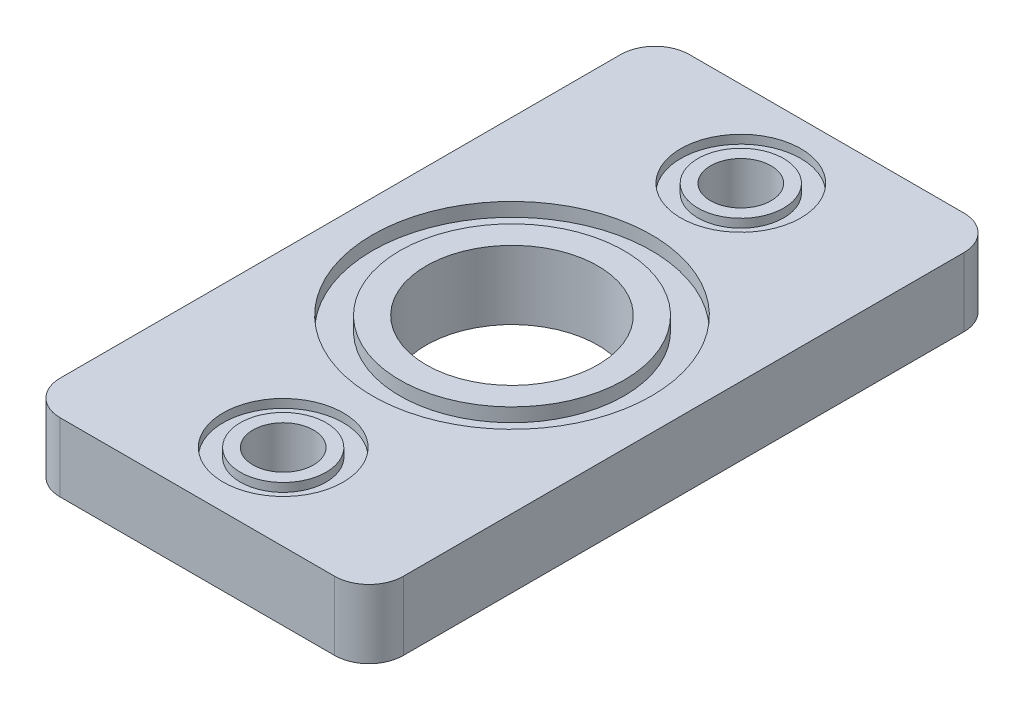
ISO-10303-21;
HEADER;
FILE_DESCRIPTION(('STEP AP214'),'2;1');
FILE_NAME('part.step','',(''),(''),'','','');
FILE_SCHEMA(('AUTOMOTIVE_DESIGN { 1 0 10303 214 1 1 1 1 }'));
ENDSEC;
DATA;
#1=APPLICATION_CONTEXT('core data for automotive mechanical design processes');
#2=APPLICATION_PROTOCOL_DEFINITION('international standard','automotive_design',2000,#1);
#3=PRODUCT_CONTEXT('',#1,'mechanical');
#4=PRODUCT('Part','Part','',(#3));
#5=PRODUCT_RELATED_PRODUCT_CATEGORY('part','',(#4));
#6=PRODUCT_DEFINITION_FORMATION('','',#4);
#7=PRODUCT_DEFINITION_CONTEXT('part definition',#1,'design');
#8=PRODUCT_DEFINITION('design','',#6,#7);
#9=PRODUCT_DEFINITION_SHAPE('','',#8);
#10=(LENGTH_UNIT() NAMED_UNIT(*) SI_UNIT(.MILLI.,.METRE.));
#11=(NAMED_UNIT(*) PLANE_ANGLE_UNIT() SI_UNIT($,.RADIAN.));
#12=(NAMED_UNIT(*) SI_UNIT($,.STERADIAN.) SOLID_ANGLE_UNIT());
#13=UNCERTAINTY_MEASURE_WITH_UNIT(LENGTH_MEASURE(1.E-05),#10,'distance_accuracy_value','');
#14=(GEOMETRIC_REPRESENTATION_CONTEXT(3) GLOBAL_UNCERTAINTY_ASSIGNED_CONTEXT((#13)) GLOBAL_UNIT_ASSIGNED_CONTEXT((#10,
#11,#12)) REPRESENTATION_CONTEXT('',''));
#15=CARTESIAN_POINT('',(0.,0.,0.));
#16=DIRECTION('',(0.,0.,1.));
#17=DIRECTION('',(1.,0.,0.));
#18=AXIS2_PLACEMENT_3D('',#15,#16,#17);
#19=CARTESIAN_POINT('',(0.,6.,0.));
#20=DIRECTION('',(0.,-1.,0.));
#21=DIRECTION('',(0.,0.,-1.));
#22=AXIS2_PLACEMENT_3D('',#19,#20,#21);
#23=PLANE('',#22);
#24=CARTESIAN_POINT('',(0.,6.,20.));
#25=DIRECTION('',(0.,1.,0.));
#26=DIRECTION('',(0.,0.,-1.));
#27=AXIS2_PLACEMENT_3D('',#24,#25,#26);
#28=CIRCLE('',#27,2.65);
#29=CARTESIAN_POINT('',(0.,6.,22.65));
#30=VERTEX_POINT('',#29);
#31=EDGE_CURVE('E199',#30,#30,#28,.T.);
#32=ORIENTED_EDGE('',*,*,#31,.F.);
#33=EDGE_LOOP('',(#32));
#34=FACE_BOUND('',#33,.T.);
#35=CARTESIAN_POINT('',(0.,6.,20.));
#36=DIRECTION('',(0.,1.,0.));
#37=DIRECTION('',(1.,0.,0.));
#38=AXIS2_PLACEMENT_3D('',#35,#36,#37);
#39=CIRCLE('',#38,3.75);
#40=CARTESIAN_POINT('',(3.75,6.,20.));
#41=VERTEX_POINT('',#40);
#42=EDGE_CURVE('E232',#41,#41,#39,.T.);
#43=ORIENTED_EDGE('',*,*,#42,.T.);
#44=EDGE_LOOP('',(#43));
#45=FACE_BOUND('',#44,.T.);
#46=ADVANCED_FACE('F57',(#34,#45),#23,.F.);
#47=CARTESIAN_POINT('',(0.,6.,-20.));
#48=DIRECTION('',(0.,1.,0.));
#49=DIRECTION('',(0.,0.,1.));
#50=AXIS2_PLACEMENT_3D('',#47,#48,#49);
#51=CIRCLE('',#50,2.65);
#52=CARTESIAN_POINT('',(0.,6.,-17.35));
#53=VERTEX_POINT('',#52);
#54=EDGE_CURVE('E204',#53,#53,#51,.T.);
#55=ORIENTED_EDGE('',*,*,#54,.F.);
#56=EDGE_LOOP('',(#55));
#57=FACE_BOUND('',#56,.T.);
#58=CARTESIAN_POINT('',(0.,6.,-20.));
#59=DIRECTION('',(0.,1.,0.));
#60=DIRECTION('',(1.,0.,0.));
#61=AXIS2_PLACEMENT_3D('',#58,#59,#60);
#62=CIRCLE('',#61,3.75);
#63=CARTESIAN_POINT('',(3.75,6.,-20.));
#64=VERTEX_POINT('',#63);
#65=EDGE_CURVE('E233',#64,#64,#62,.T.);
#66=ORIENTED_EDGE('',*,*,#65,.T.);
#67=EDGE_LOOP('',(#66));
#68=FACE_BOUND('',#67,.T.);
#69=ADVANCED_FACE('F292',(#57,#68),#23,.F.);
#70=CARTESIAN_POINT('',(0.,6.,0.));
#71=DIRECTION('',(0.,1.,0.));
#72=DIRECTION('',(0.,0.,1.));
#73=AXIS2_PLACEMENT_3D('',#70,#71,#72);
#74=CIRCLE('',#73,7.50000000000001);
#75=CARTESIAN_POINT('',(0.,6.,7.50000000000001));
#76=VERTEX_POINT('',#75);
#77=EDGE_CURVE('E187',#76,#76,#74,.T.);
#78=ORIENTED_EDGE('',*,*,#77,.F.);
#79=EDGE_LOOP('',(#78));
#80=FACE_BOUND('',#79,.T.);
#81=CARTESIAN_POINT('',(0.,6.,0.));
#82=DIRECTION('',(0.,1.,0.));
#83=DIRECTION('',(1.,0.,0.));
#84=AXIS2_PLACEMENT_3D('',#81,#82,#83);
#85=CIRCLE('',#84,9.8);
#86=CARTESIAN_POINT('',(9.8,6.,0.));
#87=VERTEX_POINT('',#86);
#88=EDGE_CURVE('E219',#87,#87,#85,.T.);
#89=ORIENTED_EDGE('',*,*,#88,.T.);
#90=EDGE_LOOP('',(#89));
#91=FACE_BOUND('',#90,.T.);
#92=ADVANCED_FACE('F269',(#80,#91),#23,.F.);
#93=CARTESIAN_POINT('',(-15.,6.,-27.5));
#94=DIRECTION('',(1.,0.,0.));
#95=DIRECTION('',(0.,0.,-1.));
#96=AXIS2_PLACEMENT_3D('',#93,#94,#95);
#97=PLANE('',#96);
#98=DIRECTION('',(0.,0.,1.));
#99=VECTOR('',#98,1.);
#100=CARTESIAN_POINT('',(-15.,6.,-27.5));
#101=LINE('',#100,#99);
#102=CARTESIAN_POINT('',(-15.,6.,-24.5));
#103=VERTEX_POINT('',#102);
#104=CARTESIAN_POINT('',(-15.,6.,24.5));
#105=VERTEX_POINT('',#104);
#106=EDGE_CURVE('E149',#103,#105,#101,.T.);
#107=ORIENTED_EDGE('',*,*,#106,.F.);
#108=DIRECTION('',(0.,-1.,0.));
#109=VECTOR('',#108,1.);
#110=CARTESIAN_POINT('',(-15.,6.,-24.5));
#111=LINE('',#110,#109);
#112=CARTESIAN_POINT('',(-15.,0.,-24.5));
#113=VERTEX_POINT('',#112);
#114=EDGE_CURVE('E175',#103,#113,#111,.T.);
#115=ORIENTED_EDGE('',*,*,#114,.T.);
#116=DIRECTION('',(0.,0.,1.));
#117=VECTOR('',#116,1.);
#118=CARTESIAN_POINT('',(-15.,0.,-27.5));
#119=LINE('',#118,#117);
#120=CARTESIAN_POINT('',(-15.,0.,24.5));
#121=VERTEX_POINT('',#120);
#122=EDGE_CURVE('E182',#113,#121,#119,.T.);
#123=ORIENTED_EDGE('',*,*,#122,.T.);
#124=DIRECTION('',(0.,-1.,0.));
#125=VECTOR('',#124,1.);
#126=CARTESIAN_POINT('',(-15.,6.,24.5));
#127=LINE('',#126,#125);
#128=EDGE_CURVE('E173',#121,#105,#127,.F.);
#129=ORIENTED_EDGE('',*,*,#128,.T.);
#130=EDGE_LOOP('',(#107,#115,#123,#129));
#131=FACE_BOUND('',#130,.T.);
#132=ADVANCED_FACE('F181',(#131),#97,.F.);
#133=CARTESIAN_POINT('',(15.,6.,27.5));
#134=DIRECTION('',(0.,0.,-1.));
#135=DIRECTION('',(-1.,0.,0.));
#136=AXIS2_PLACEMENT_3D('',#133,#134,#135);
#137=PLANE('',#136);
#138=DIRECTION('',(1.,0.,0.));
#139=VECTOR('',#138,1.);
#140=CARTESIAN_POINT('',(15.,6.,27.5));
#141=LINE('',#140,#139);
#142=CARTESIAN_POINT('',(-12.,6.,27.5));
#143=VERTEX_POINT('',#142);
#144=CARTESIAN_POINT('',(12.,6.,27.5));
#145=VERTEX_POINT('',#144);
#146=EDGE_CURVE('E152',#143,#145,#141,.T.);
#147=ORIENTED_EDGE('',*,*,#146,.F.);
#148=DIRECTION('',(0.,-1.,0.));
#149=VECTOR('',#148,1.);
#150=CARTESIAN_POINT('',(-12.,6.,27.5));
#151=LINE('',#150,#149);
#152=CARTESIAN_POINT('',(-12.,0.,27.5));
#153=VERTEX_POINT('',#152);
#154=EDGE_CURVE('E12',#143,#153,#151,.T.);
#155=ORIENTED_EDGE('',*,*,#154,.T.);
#156=DIRECTION('',(1.,0.,0.));
#157=VECTOR('',#156,1.);
#158=CARTESIAN_POINT('',(15.,0.,27.5));
#159=LINE('',#158,#157);
#160=CARTESIAN_POINT('',(12.,0.,27.5));
#161=VERTEX_POINT('',#160);
#162=EDGE_CURVE('E154',#153,#161,#159,.T.);
#163=ORIENTED_EDGE('',*,*,#162,.T.);
#164=DIRECTION('',(0.,-1.,0.));
#165=VECTOR('',#164,1.);
#166=CARTESIAN_POINT('',(12.,6.,27.5));
#167=LINE('',#166,#165);
#168=EDGE_CURVE('E65',#161,#145,#167,.F.);
#169=ORIENTED_EDGE('',*,*,#168,.T.);
#170=EDGE_LOOP('',(#147,#155,#163,#169));
#171=FACE_BOUND('',#170,.T.);
#172=ADVANCED_FACE('F279',(#171),#137,.F.);
#173=CARTESIAN_POINT('',(15.,6.,-27.5));
#174=DIRECTION('',(-1.,0.,0.));
#175=DIRECTION('',(0.,0.,1.));
#176=AXIS2_PLACEMENT_3D('',#173,#174,#175);
#177=PLANE('',#176);
#178=DIRECTION('',(0.,0.,-1.));
#179=VECTOR('',#178,1.);
#180=CARTESIAN_POINT('',(15.,0.,-27.5));
#181=LINE('',#180,#179);
#182=CARTESIAN_POINT('',(15.,0.,24.5));
#183=VERTEX_POINT('',#182);
#184=CARTESIAN_POINT('',(15.,0.,-24.5));
#185=VERTEX_POINT('',#184);
#186=EDGE_CURVE('E150',#183,#185,#181,.T.);
#187=ORIENTED_EDGE('',*,*,#186,.T.);
#188=DIRECTION('',(0.,-1.,0.));
#189=VECTOR('',#188,1.);
#190=CARTESIAN_POINT('',(15.,6.,-24.5));
#191=LINE('',#190,#189);
#192=CARTESIAN_POINT('',(15.,6.,-24.5));
#193=VERTEX_POINT('',#192);
#194=EDGE_CURVE('E128',#185,#193,#191,.F.);
#195=ORIENTED_EDGE('',*,*,#194,.T.);
#196=DIRECTION('',(0.,0.,-1.));
#197=VECTOR('',#196,1.);
#198=CARTESIAN_POINT('',(15.,6.,-27.5));
#199=LINE('',#198,#197);
#200=CARTESIAN_POINT('',(15.,6.,24.5));
#201=VERTEX_POINT('',#200);
#202=EDGE_CURVE('E194',#201,#193,#199,.T.);
#203=ORIENTED_EDGE('',*,*,#202,.F.);
#204=DIRECTION('',(0.,-1.,0.));
#205=VECTOR('',#204,1.);
#206=CARTESIAN_POINT('',(15.,6.,24.5));
#207=LINE('',#206,#205);
#208=EDGE_CURVE('E133',#201,#183,#207,.T.);
#209=ORIENTED_EDGE('',*,*,#208,.T.);
#210=EDGE_LOOP('',(#187,#195,#203,#209));
#211=FACE_BOUND('',#210,.T.);
#212=ADVANCED_FACE('F277',(#211),#177,.F.);
#213=CARTESIAN_POINT('',(15.,6.,-27.5));
#214=DIRECTION('',(0.,0.,1.));
#215=DIRECTION('',(1.,0.,0.));
#216=AXIS2_PLACEMENT_3D('',#213,#214,#215);
#217=PLANE('',#216);
#218=DIRECTION('',(-1.,0.,0.));
#219=VECTOR('',#218,1.);
#220=CARTESIAN_POINT('',(15.,6.,-27.5));
#221=LINE('',#220,#219);
#222=CARTESIAN_POINT('',(12.,6.,-27.5));
#223=VERTEX_POINT('',#222);
#224=CARTESIAN_POINT('',(-12.,6.,-27.5));
#225=VERTEX_POINT('',#224);
#226=EDGE_CURVE('E143',#223,#225,#221,.T.);
#227=ORIENTED_EDGE('',*,*,#226,.F.);
#228=DIRECTION('',(0.,-1.,0.));
#229=VECTOR('',#228,1.);
#230=CARTESIAN_POINT('',(12.,6.,-27.5));
#231=LINE('',#230,#229);
#232=CARTESIAN_POINT('',(12.,0.,-27.5));
#233=VERTEX_POINT('',#232);
#234=EDGE_CURVE('E127',#223,#233,#231,.T.);
#235=ORIENTED_EDGE('',*,*,#234,.T.);
#236=DIRECTION('',(-1.,0.,0.));
#237=VECTOR('',#236,1.);
#238=CARTESIAN_POINT('',(15.,0.,-27.5));
#239=LINE('',#238,#237);
#240=CARTESIAN_POINT('',(-12.,0.,-27.5));
#241=VERTEX_POINT('',#240);
#242=EDGE_CURVE('E140',#233,#241,#239,.T.);
#243=ORIENTED_EDGE('',*,*,#242,.T.);
#244=DIRECTION('',(0.,-1.,0.));
#245=VECTOR('',#244,1.);
#246=CARTESIAN_POINT('',(-12.,6.,-27.5));
#247=LINE('',#246,#245);
#248=EDGE_CURVE('E145',#241,#225,#247,.F.);
#249=ORIENTED_EDGE('',*,*,#248,.T.);
#250=EDGE_LOOP('',(#227,#235,#243,#249));
#251=FACE_BOUND('',#250,.T.);
#252=ADVANCED_FACE('F139',(#251),#217,.F.);
#253=CARTESIAN_POINT('',(0.,6.,20.));
#254=DIRECTION('',(0.,1.,0.));
#255=DIRECTION('',(1.,0.,0.));
#256=AXIS2_PLACEMENT_3D('',#253,#254,#255);
#257=CIRCLE('',#256,5.25);
#258=CARTESIAN_POINT('',(5.25,6.,20.));
#259=VERTEX_POINT('',#258);
#260=EDGE_CURVE('E238',#259,#259,#257,.T.);
#261=ORIENTED_EDGE('',*,*,#260,.F.);
#262=EDGE_LOOP('',(#261));
#263=FACE_BOUND('',#262,.T.);
#264=CARTESIAN_POINT('',(0.,6.,-20.));
#265=DIRECTION('',(0.,1.,0.));
#266=DIRECTION('',(1.,0.,0.));
#267=AXIS2_PLACEMENT_3D('',#264,#265,#266);
#268=CIRCLE('',#267,5.25);
#269=CARTESIAN_POINT('',(5.25,6.,-20.));
#270=VERTEX_POINT('',#269);
#271=EDGE_CURVE('E225',#270,#270,#268,.T.);
#272=ORIENTED_EDGE('',*,*,#271,.F.);
#273=EDGE_LOOP('',(#272));
#274=FACE_BOUND('',#273,.T.);
#275=CARTESIAN_POINT('',(0.,6.,0.));
#276=DIRECTION('',(0.,1.,0.));
#277=DIRECTION('',(1.,0.,0.));
#278=AXIS2_PLACEMENT_3D('',#275,#276,#277);
#279=CIRCLE('',#278,12.2);
#280=CARTESIAN_POINT('',(12.2,6.,0.));
#281=VERTEX_POINT('',#280);
#282=EDGE_CURVE('E213',#281,#281,#279,.T.);
#283=ORIENTED_EDGE('',*,*,#282,.F.);
#284=EDGE_LOOP('',(#283));
#285=FACE_BOUND('',#284,.T.);
#286=ORIENTED_EDGE('',*,*,#202,.T.);
#287=CARTESIAN_POINT('',(12.,6.,-24.5));
#288=DIRECTION('',(0.,-1.,0.));
#289=DIRECTION('',(0.,0.,-1.));
#290=AXIS2_PLACEMENT_3D('',#287,#288,#289);
#291=CIRCLE('',#290,3.);
#292=EDGE_CURVE('E171',#193,#223,#291,.F.);
#293=ORIENTED_EDGE('',*,*,#292,.T.);
#294=ORIENTED_EDGE('',*,*,#226,.T.);
#295=CARTESIAN_POINT('',(-12.,6.,-24.5));
#296=DIRECTION('',(0.,-1.,0.));
#297=DIRECTION('',(0.,0.,-1.));
#298=AXIS2_PLACEMENT_3D('',#295,#296,#297);
#299=CIRCLE('',#298,3.);
#300=EDGE_CURVE('E169',#225,#103,#299,.F.);
#301=ORIENTED_EDGE('',*,*,#300,.T.);
#302=ORIENTED_EDGE('',*,*,#106,.T.);
#303=CARTESIAN_POINT('',(-12.,6.,24.5));
#304=DIRECTION('',(0.,-1.,0.));
#305=DIRECTION('',(0.,0.,-1.));
#306=AXIS2_PLACEMENT_3D('',#303,#304,#305);
#307=CIRCLE('',#306,3.);
#308=EDGE_CURVE('E78',#105,#143,#307,.F.);
#309=ORIENTED_EDGE('',*,*,#308,.T.);
#310=ORIENTED_EDGE('',*,*,#146,.T.);
#311=CARTESIAN_POINT('',(12.,6.,24.5));
#312=DIRECTION('',(0.,-1.,0.));
#313=DIRECTION('',(0.,0.,-1.));
#314=AXIS2_PLACEMENT_3D('',#311,#312,#313);
#315=CIRCLE('',#314,3.);
#316=EDGE_CURVE('E166',#145,#201,#315,.F.);
#317=ORIENTED_EDGE('',*,*,#316,.T.);
#318=EDGE_LOOP('',(#286,#293,#294,#301,#302,#309,#310,#317));
#319=FACE_BOUND('',#318,.T.);
#320=ADVANCED_FACE('F265',(#263,#274,#285,#319),#23,.F.);
#321=CARTESIAN_POINT('',(0.,0.,0.));
#322=DIRECTION('',(0.,-1.,0.));
#323=DIRECTION('',(0.,0.,-1.));
#324=AXIS2_PLACEMENT_3D('',#321,#322,#323);
#325=PLANE('',#324);
#326=CARTESIAN_POINT('',(0.,0.,20.));
#327=DIRECTION('',(0.,-1.,0.));
#328=DIRECTION('',(0.,0.,-1.));
#329=AXIS2_PLACEMENT_3D('',#326,#327,#328);
#330=CIRCLE('',#329,2.65);
#331=CARTESIAN_POINT('',(0.,0.,22.65));
#332=VERTEX_POINT('',#331);
#333=EDGE_CURVE('E208',#332,#332,#330,.F.);
#334=ORIENTED_EDGE('',*,*,#333,.T.);
#335=EDGE_LOOP('',(#334));
#336=FACE_BOUND('',#335,.T.);
#337=CARTESIAN_POINT('',(0.,0.,-20.));
#338=DIRECTION('',(0.,-1.,0.));
#339=DIRECTION('',(0.,0.,-1.));
#340=AXIS2_PLACEMENT_3D('',#337,#338,#339);
#341=CIRCLE('',#340,2.65);
#342=CARTESIAN_POINT('',(0.,0.,-17.35));
#343=VERTEX_POINT('',#342);
#344=EDGE_CURVE('E201',#343,#343,#341,.F.);
#345=ORIENTED_EDGE('',*,*,#344,.T.);
#346=EDGE_LOOP('',(#345));
#347=FACE_BOUND('',#346,.T.);
#348=CARTESIAN_POINT('',(0.,0.,0.));
#349=DIRECTION('',(0.,-1.,0.));
#350=DIRECTION('',(0.,0.,-1.));
#351=AXIS2_PLACEMENT_3D('',#348,#349,#350);
#352=CIRCLE('',#351,7.50000000000001);
#353=CARTESIAN_POINT('',(0.,0.,7.50000000000001));
#354=VERTEX_POINT('',#353);
#355=EDGE_CURVE('E190',#354,#354,#352,.F.);
#356=ORIENTED_EDGE('',*,*,#355,.T.);
#357=EDGE_LOOP('',(#356));
#358=FACE_BOUND('',#357,.T.);
#359=ORIENTED_EDGE('',*,*,#242,.F.);
#360=CARTESIAN_POINT('',(12.,0.,-24.5));
#361=DIRECTION('',(0.,-1.,0.));
#362=DIRECTION('',(0.,0.,-1.));
#363=AXIS2_PLACEMENT_3D('',#360,#361,#362);
#364=CIRCLE('',#363,3.);
#365=EDGE_CURVE('E123',#233,#185,#364,.T.);
#366=ORIENTED_EDGE('',*,*,#365,.T.);
#367=ORIENTED_EDGE('',*,*,#186,.F.);
#368=CARTESIAN_POINT('',(12.,0.,24.5));
#369=DIRECTION('',(0.,-1.,0.));
#370=DIRECTION('',(0.,0.,-1.));
#371=AXIS2_PLACEMENT_3D('',#368,#369,#370);
#372=CIRCLE('',#371,3.);
#373=EDGE_CURVE('E144',#183,#161,#372,.T.);
#374=ORIENTED_EDGE('',*,*,#373,.T.);
#375=ORIENTED_EDGE('',*,*,#162,.F.);
#376=CARTESIAN_POINT('',(-12.,0.,24.5));
#377=DIRECTION('',(0.,-1.,0.));
#378=DIRECTION('',(0.,0.,-1.));
#379=AXIS2_PLACEMENT_3D('',#376,#377,#378);
#380=CIRCLE('',#379,3.);
#381=EDGE_CURVE('E160',#153,#121,#380,.T.);
#382=ORIENTED_EDGE('',*,*,#381,.T.);
#383=ORIENTED_EDGE('',*,*,#122,.F.);
#384=CARTESIAN_POINT('',(-12.,0.,-24.5));
#385=DIRECTION('',(0.,-1.,0.));
#386=DIRECTION('',(0.,0.,-1.));
#387=AXIS2_PLACEMENT_3D('',#384,#385,#386);
#388=CIRCLE('',#387,3.);
#389=EDGE_CURVE('E134',#113,#241,#388,.T.);
#390=ORIENTED_EDGE('',*,*,#389,.T.);
#391=EDGE_LOOP('',(#359,#366,#367,#374,#375,#382,#383,#390));
#392=FACE_BOUND('',#391,.T.);
#393=ADVANCED_FACE('F147',(#336,#347,#358,#392),#325,.T.);
#394=CARTESIAN_POINT('',(0.,-0.00100000000000013,0.));
#395=DIRECTION('',(0.,1.,0.));
#396=DIRECTION('',(0.,0.,1.));
#397=AXIS2_PLACEMENT_3D('',#394,#395,#396);
#398=CYLINDRICAL_SURFACE('',#397,7.50000000000001);
#399=CARTESIAN_POINT('',(0.,0.,7.50000000000001));
#400=CARTESIAN_POINT('',(0.,0.0624999999999999,7.50000000000001));
#401=CARTESIAN_POINT('',(0.,0.125,7.50000000000001));
#402=CARTESIAN_POINT('',(0.,0.25,7.50000000000001));
#403=CARTESIAN_POINT('',(0.,0.3125,7.50000000000001));
#404=CARTESIAN_POINT('',(0.,0.4375,7.50000000000001));
#405=CARTESIAN_POINT('',(0.,0.5,7.50000000000001));
#406=CARTESIAN_POINT('',(0.,0.625,7.50000000000001));
#407=CARTESIAN_POINT('',(0.,0.6875,7.50000000000001));
#408=CARTESIAN_POINT('',(0.,0.8125,7.50000000000001));
#409=CARTESIAN_POINT('',(0.,0.875,7.50000000000001));
#410=CARTESIAN_POINT('',(0.,1.,7.50000000000001));
#411=CARTESIAN_POINT('',(0.,1.0625,7.50000000000001));
#412=CARTESIAN_POINT('',(0.,1.1875,7.50000000000001));
#413=CARTESIAN_POINT('',(0.,1.25,7.50000000000001));
#414=CARTESIAN_POINT('',(0.,1.375,7.50000000000001));
#415=CARTESIAN_POINT('',(0.,1.4375,7.50000000000001));
#416=CARTESIAN_POINT('',(0.,1.5625,7.50000000000001));
#417=CARTESIAN_POINT('',(0.,1.625,7.50000000000001));
#418=CARTESIAN_POINT('',(0.,1.75,7.50000000000001));
#419=CARTESIAN_POINT('',(0.,1.8125,7.50000000000001));
#420=CARTESIAN_POINT('',(0.,1.9375,7.50000000000001));
#421=CARTESIAN_POINT('',(0.,2.,7.50000000000001));
#422=CARTESIAN_POINT('',(0.,2.125,7.50000000000001));
#423=CARTESIAN_POINT('',(0.,2.1875,7.50000000000001));
#424=CARTESIAN_POINT('',(0.,2.3125,7.50000000000001));
#425=CARTESIAN_POINT('',(0.,2.375,7.50000000000001));
#426=CARTESIAN_POINT('',(0.,2.5,7.50000000000001));
#427=CARTESIAN_POINT('',(0.,2.5625,7.50000000000001));
#428=CARTESIAN_POINT('',(0.,2.6875,7.50000000000001));
#429=CARTESIAN_POINT('',(0.,2.75,7.50000000000001));
#430=CARTESIAN_POINT('',(0.,2.875,7.50000000000001));
#431=CARTESIAN_POINT('',(0.,2.9375,7.50000000000001));
#432=CARTESIAN_POINT('',(0.,3.0625,7.50000000000001));
#433=CARTESIAN_POINT('',(0.,3.125,7.50000000000001));
#434=CARTESIAN_POINT('',(0.,3.25,7.50000000000001));
#435=CARTESIAN_POINT('',(0.,3.3125,7.50000000000001));
#436=CARTESIAN_POINT('',(0.,3.4375,7.50000000000001));
#437=CARTESIAN_POINT('',(0.,3.5,7.50000000000001));
#438=CARTESIAN_POINT('',(0.,3.625,7.50000000000001));
#439=CARTESIAN_POINT('',(0.,3.6875,7.50000000000001));
#440=CARTESIAN_POINT('',(0.,3.8125,7.50000000000001));
#441=CARTESIAN_POINT('',(0.,3.875,7.50000000000001));
#442=CARTESIAN_POINT('',(0.,4.,7.50000000000001));
#443=CARTESIAN_POINT('',(0.,4.0625,7.50000000000001));
#444=CARTESIAN_POINT('',(0.,4.1875,7.50000000000001));
#445=CARTESIAN_POINT('',(0.,4.25,7.50000000000001));
#446=CARTESIAN_POINT('',(0.,4.375,7.50000000000001));
#447=CARTESIAN_POINT('',(0.,4.4375,7.50000000000001));
#448=CARTESIAN_POINT('',(0.,4.5625,7.50000000000001));
#449=CARTESIAN_POINT('',(0.,4.625,7.50000000000001));
#450=CARTESIAN_POINT('',(0.,4.75,7.50000000000001));
#451=CARTESIAN_POINT('',(0.,4.8125,7.50000000000001));
#452=CARTESIAN_POINT('',(0.,4.9375,7.50000000000001));
#453=CARTESIAN_POINT('',(0.,5.,7.50000000000001));
#454=CARTESIAN_POINT('',(0.,5.125,7.50000000000001));
#455=CARTESIAN_POINT('',(0.,5.1875,7.50000000000001));
#456=CARTESIAN_POINT('',(0.,5.3125,7.50000000000001));
#457=CARTESIAN_POINT('',(0.,5.375,7.50000000000001));
#458=CARTESIAN_POINT('',(0.,5.5,7.50000000000001));
#459=CARTESIAN_POINT('',(0.,5.5625,7.50000000000001));
#460=CARTESIAN_POINT('',(0.,5.6875,7.50000000000001));
#461=CARTESIAN_POINT('',(0.,5.75,7.50000000000001));
#462=CARTESIAN_POINT('',(0.,5.875,7.50000000000001));
#463=CARTESIAN_POINT('',(0.,5.9375,7.50000000000001));
#464=CARTESIAN_POINT('',(0.,6.,7.50000000000001));
#465=B_SPLINE_CURVE_WITH_KNOTS('',3,(#399,#400,#401,#402,#403,#404,#405,#406,#407,#408,#409,
#410,#411,#412,#413,#414,#415,#416,#417,#418,#419,#420,#421,#422,#423,#424,#425,#426,#427,#428,
#429,#430,#431,#432,#433,#434,#435,#436,#437,#438,#439,#440,#441,#442,#443,#444,#445,#446,#447,
#448,#449,#450,#451,#452,#453,#454,#455,#456,#457,#458,#459,#460,#461,#462,#463,#464),
.UNSPECIFIED.,.F.,.F.,(4,2,2,2,2,2,2,2,2,2,2,2,2,2,2,2,2,2,2,2,2,2,2,2,2,2,2,2,2,2,2,2,4),(0.,
0.1875,0.375,0.5625,0.75,0.9375,1.125,1.3125,1.5,1.6875,1.875,2.0625,2.25,2.4375,2.625,2.8125,
3.,3.1875,3.375,3.5625,3.75,3.9375,4.125,4.3125,4.5,4.6875,4.875,5.0625,5.25,5.4375,5.625,
5.8125,6.),.UNSPECIFIED.);
#466=EDGE_CURVE('BSEAM302',#354,#76,#465,.T.);
#467=ORIENTED_EDGE('',*,*,#355,.F.);
#468=ORIENTED_EDGE('',*,*,#77,.T.);
#469=ORIENTED_EDGE('',*,*,#466,.T.);
#470=ORIENTED_EDGE('',*,*,#466,.F.);
#471=EDGE_LOOP('',(#467,#469,#468,#470));
#472=FACE_BOUND('',#471,.T.);
#473=ADVANCED_FACE('F302',(#472),#398,.F.);
#474=CARTESIAN_POINT('',(0.,-0.00100000000000013,-20.));
#475=DIRECTION('',(0.,1.,0.));
#476=DIRECTION('',(0.,0.,1.));
#477=AXIS2_PLACEMENT_3D('',#474,#475,#476);
#478=CYLINDRICAL_SURFACE('',#477,2.65);
#479=CARTESIAN_POINT('',(0.,0.,-17.35));
#480=CARTESIAN_POINT('',(0.,0.0624999999999999,-17.35));
#481=CARTESIAN_POINT('',(0.,0.125,-17.35));
#482=CARTESIAN_POINT('',(0.,0.25,-17.35));
#483=CARTESIAN_POINT('',(0.,0.3125,-17.35));
#484=CARTESIAN_POINT('',(0.,0.4375,-17.35));
#485=CARTESIAN_POINT('',(0.,0.5,-17.35));
#486=CARTESIAN_POINT('',(0.,0.625,-17.35));
#487=CARTESIAN_POINT('',(0.,0.6875,-17.35));
#488=CARTESIAN_POINT('',(0.,0.8125,-17.35));
#489=CARTESIAN_POINT('',(0.,0.875,-17.35));
#490=CARTESIAN_POINT('',(0.,1.,-17.35));
#491=CARTESIAN_POINT('',(0.,1.0625,-17.35));
#492=CARTESIAN_POINT('',(0.,1.1875,-17.35));
#493=CARTESIAN_POINT('',(0.,1.25,-17.35));
#494=CARTESIAN_POINT('',(0.,1.375,-17.35));
#495=CARTESIAN_POINT('',(0.,1.4375,-17.35));
#496=CARTESIAN_POINT('',(0.,1.5625,-17.35));
#497=CARTESIAN_POINT('',(0.,1.625,-17.35));
#498=CARTESIAN_POINT('',(0.,1.75,-17.35));
#499=CARTESIAN_POINT('',(0.,1.8125,-17.35));
#500=CARTESIAN_POINT('',(0.,1.9375,-17.35));
#501=CARTESIAN_POINT('',(0.,2.,-17.35));
#502=CARTESIAN_POINT('',(0.,2.125,-17.35));
#503=CARTESIAN_POINT('',(0.,2.1875,-17.35));
#504=CARTESIAN_POINT('',(0.,2.3125,-17.35));
#505=CARTESIAN_POINT('',(0.,2.375,-17.35));
#506=CARTESIAN_POINT('',(0.,2.5,-17.35));
#507=CARTESIAN_POINT('',(0.,2.5625,-17.35));
#508=CARTESIAN_POINT('',(0.,2.6875,-17.35));
#509=CARTESIAN_POINT('',(0.,2.75,-17.35));
#510=CARTESIAN_POINT('',(0.,2.875,-17.35));
#511=CARTESIAN_POINT('',(0.,2.9375,-17.35));
#512=CARTESIAN_POINT('',(0.,3.0625,-17.35));
#513=CARTESIAN_POINT('',(0.,3.125,-17.35));
#514=CARTESIAN_POINT('',(0.,3.25,-17.35));
#515=CARTESIAN_POINT('',(0.,3.3125,-17.35));
#516=CARTESIAN_POINT('',(0.,3.4375,-17.35));
#517=CARTESIAN_POINT('',(0.,3.5,-17.35));
#518=CARTESIAN_POINT('',(0.,3.625,-17.35));
#519=CARTESIAN_POINT('',(0.,3.6875,-17.35));
#520=CARTESIAN_POINT('',(0.,3.8125,-17.35));
#521=CARTESIAN_POINT('',(0.,3.875,-17.35));
#522=CARTESIAN_POINT('',(0.,4.,-17.35));
#523=CARTESIAN_POINT('',(0.,4.0625,-17.35));
#524=CARTESIAN_POINT('',(0.,4.1875,-17.35));
#525=CARTESIAN_POINT('',(0.,4.25,-17.35));
#526=CARTESIAN_POINT('',(0.,4.375,-17.35));
#527=CARTESIAN_POINT('',(0.,4.4375,-17.35));
#528=CARTESIAN_POINT('',(0.,4.5625,-17.35));
#529=CARTESIAN_POINT('',(0.,4.625,-17.35));
#530=CARTESIAN_POINT('',(0.,4.75,-17.35));
#531=CARTESIAN_POINT('',(0.,4.8125,-17.35));
#532=CARTESIAN_POINT('',(0.,4.9375,-17.35));
#533=CARTESIAN_POINT('',(0.,5.,-17.35));
#534=CARTESIAN_POINT('',(0.,5.125,-17.35));
#535=CARTESIAN_POINT('',(0.,5.1875,-17.35));
#536=CARTESIAN_POINT('',(0.,5.3125,-17.35));
#537=CARTESIAN_POINT('',(0.,5.375,-17.35));
#538=CARTESIAN_POINT('',(0.,5.5,-17.35));
#539=CARTESIAN_POINT('',(0.,5.5625,-17.35));
#540=CARTESIAN_POINT('',(0.,5.6875,-17.35));
#541=CARTESIAN_POINT('',(0.,5.75,-17.35));
#542=CARTESIAN_POINT('',(0.,5.875,-17.35));
#543=CARTESIAN_POINT('',(0.,5.9375,-17.35));
#544=CARTESIAN_POINT('',(0.,6.,-17.35));
#545=B_SPLINE_CURVE_WITH_KNOTS('',3,(#479,#480,#481,#482,#483,#484,#485,#486,#487,#488,#489,
#490,#491,#492,#493,#494,#495,#496,#497,#498,#499,#500,#501,#502,#503,#504,#505,#506,#507,#508,
#509,#510,#511,#512,#513,#514,#515,#516,#517,#518,#519,#520,#521,#522,#523,#524,#525,#526,#527,
#528,#529,#530,#531,#532,#533,#534,#535,#536,#537,#538,#539,#540,#541,#542,#543,#544),
.UNSPECIFIED.,.F.,.F.,(4,2,2,2,2,2,2,2,2,2,2,2,2,2,2,2,2,2,2,2,2,2,2,2,2,2,2,2,2,2,2,2,4),(0.,
0.1875,0.375,0.5625,0.75,0.9375,1.125,1.3125,1.5,1.6875,1.875,2.0625,2.25,2.4375,2.625,2.8125,
3.,3.1875,3.375,3.5625,3.75,3.9375,4.125,4.3125,4.5,4.6875,4.875,5.0625,5.25,5.4375,5.625,
5.8125,6.),.UNSPECIFIED.);
#546=EDGE_CURVE('BSEAM348',#343,#53,#545,.T.);
#547=ORIENTED_EDGE('',*,*,#344,.F.);
#548=ORIENTED_EDGE('',*,*,#54,.T.);
#549=ORIENTED_EDGE('',*,*,#546,.T.);
#550=ORIENTED_EDGE('',*,*,#546,.F.);
#551=EDGE_LOOP('',(#547,#549,#548,#550));
#552=FACE_BOUND('',#551,.T.);
#553=ADVANCED_FACE('F348',(#552),#478,.F.);
#554=CARTESIAN_POINT('',(0.,-0.00100000000000013,20.));
#555=DIRECTION('',(0.,1.,0.));
#556=DIRECTION('',(0.,0.,1.));
#557=AXIS2_PLACEMENT_3D('',#554,#555,#556);
#558=CYLINDRICAL_SURFACE('',#557,2.65);
#559=CARTESIAN_POINT('',(0.,0.,22.65));
#560=CARTESIAN_POINT('',(0.,0.0624999999999999,22.65));
#561=CARTESIAN_POINT('',(0.,0.125,22.65));
#562=CARTESIAN_POINT('',(0.,0.25,22.65));
#563=CARTESIAN_POINT('',(0.,0.3125,22.65));
#564=CARTESIAN_POINT('',(0.,0.4375,22.65));
#565=CARTESIAN_POINT('',(0.,0.5,22.65));
#566=CARTESIAN_POINT('',(0.,0.625,22.65));
#567=CARTESIAN_POINT('',(0.,0.6875,22.65));
#568=CARTESIAN_POINT('',(0.,0.8125,22.65));
#569=CARTESIAN_POINT('',(0.,0.875,22.65));
#570=CARTESIAN_POINT('',(0.,1.,22.65));
#571=CARTESIAN_POINT('',(0.,1.0625,22.65));
#572=CARTESIAN_POINT('',(0.,1.1875,22.65));
#573=CARTESIAN_POINT('',(0.,1.25,22.65));
#574=CARTESIAN_POINT('',(0.,1.375,22.65));
#575=CARTESIAN_POINT('',(0.,1.4375,22.65));
#576=CARTESIAN_POINT('',(0.,1.5625,22.65));
#577=CARTESIAN_POINT('',(0.,1.625,22.65));
#578=CARTESIAN_POINT('',(0.,1.75,22.65));
#579=CARTESIAN_POINT('',(0.,1.8125,22.65));
#580=CARTESIAN_POINT('',(0.,1.9375,22.65));
#581=CARTESIAN_POINT('',(0.,2.,22.65));
#582=CARTESIAN_POINT('',(0.,2.125,22.65));
#583=CARTESIAN_POINT('',(0.,2.1875,22.65));
#584=CARTESIAN_POINT('',(0.,2.3125,22.65));
#585=CARTESIAN_POINT('',(0.,2.375,22.65));
#586=CARTESIAN_POINT('',(0.,2.5,22.65));
#587=CARTESIAN_POINT('',(0.,2.5625,22.65));
#588=CARTESIAN_POINT('',(0.,2.6875,22.65));
#589=CARTESIAN_POINT('',(0.,2.75,22.65));
#590=CARTESIAN_POINT('',(0.,2.875,22.65));
#591=CARTESIAN_POINT('',(0.,2.9375,22.65));
#592=CARTESIAN_POINT('',(0.,3.0625,22.65));
#593=CARTESIAN_POINT('',(0.,3.125,22.65));
#594=CARTESIAN_POINT('',(0.,3.25,22.65));
#595=CARTESIAN_POINT('',(0.,3.3125,22.65));
#596=CARTESIAN_POINT('',(0.,3.4375,22.65));
#597=CARTESIAN_POINT('',(0.,3.5,22.65));
#598=CARTESIAN_POINT('',(0.,3.625,22.65));
#599=CARTESIAN_POINT('',(0.,3.6875,22.65));
#600=CARTESIAN_POINT('',(0.,3.8125,22.65));
#601=CARTESIAN_POINT('',(0.,3.875,22.65));
#602=CARTESIAN_POINT('',(0.,4.,22.65));
#603=CARTESIAN_POINT('',(0.,4.0625,22.65));
#604=CARTESIAN_POINT('',(0.,4.1875,22.65));
#605=CARTESIAN_POINT('',(0.,4.25,22.65));
#606=CARTESIAN_POINT('',(0.,4.375,22.65));
#607=CARTESIAN_POINT('',(0.,4.4375,22.65));
#608=CARTESIAN_POINT('',(0.,4.5625,22.65));
#609=CARTESIAN_POINT('',(0.,4.625,22.65));
#610=CARTESIAN_POINT('',(0.,4.75,22.65));
#611=CARTESIAN_POINT('',(0.,4.8125,22.65));
#612=CARTESIAN_POINT('',(0.,4.9375,22.65));
#613=CARTESIAN_POINT('',(0.,5.,22.65));
#614=CARTESIAN_POINT('',(0.,5.125,22.65));
#615=CARTESIAN_POINT('',(0.,5.1875,22.65));
#616=CARTESIAN_POINT('',(0.,5.3125,22.65));
#617=CARTESIAN_POINT('',(0.,5.375,22.65));
#618=CARTESIAN_POINT('',(0.,5.5,22.65));
#619=CARTESIAN_POINT('',(0.,5.5625,22.65));
#620=CARTESIAN_POINT('',(0.,5.6875,22.65));
#621=CARTESIAN_POINT('',(0.,5.75,22.65));
#622=CARTESIAN_POINT('',(0.,5.875,22.65));
#623=CARTESIAN_POINT('',(0.,5.9375,22.65));
#624=CARTESIAN_POINT('',(0.,6.,22.65));
#625=B_SPLINE_CURVE_WITH_KNOTS('',3,(#559,#560,#561,#562,#563,#564,#565,#566,#567,#568,#569,
#570,#571,#572,#573,#574,#575,#576,#577,#578,#579,#580,#581,#582,#583,#584,#585,#586,#587,#588,
#589,#590,#591,#592,#593,#594,#595,#596,#597,#598,#599,#600,#601,#602,#603,#604,#605,#606,#607,
#608,#609,#610,#611,#612,#613,#614,#615,#616,#617,#618,#619,#620,#621,#622,#623,#624),
.UNSPECIFIED.,.F.,.F.,(4,2,2,2,2,2,2,2,2,2,2,2,2,2,2,2,2,2,2,2,2,2,2,2,2,2,2,2,2,2,2,2,4),(0.,
0.1875,0.375,0.5625,0.75,0.9375,1.125,1.3125,1.5,1.6875,1.875,2.0625,2.25,2.4375,2.625,2.8125,
3.,3.1875,3.375,3.5625,3.75,3.9375,4.125,4.3125,4.5,4.6875,4.875,5.0625,5.25,5.4375,5.625,
5.8125,6.),.UNSPECIFIED.);
#626=EDGE_CURVE('BSEAM345',#332,#30,#625,.T.);
#627=ORIENTED_EDGE('',*,*,#333,.F.);
#628=ORIENTED_EDGE('',*,*,#31,.T.);
#629=ORIENTED_EDGE('',*,*,#626,.T.);
#630=ORIENTED_EDGE('',*,*,#626,.F.);
#631=EDGE_LOOP('',(#627,#629,#628,#630));
#632=FACE_BOUND('',#631,.T.);
#633=ADVANCED_FACE('F345',(#632),#558,.F.);
#634=CARTESIAN_POINT('',(0.,4.8,0.));
#635=DIRECTION('',(0.,1.,0.));
#636=DIRECTION('',(0.,0.,1.));
#637=AXIS2_PLACEMENT_3D('',#634,#635,#636);
#638=CYLINDRICAL_SURFACE('',#637,12.2);
#639=CARTESIAN_POINT('',(0.,4.8,0.));
#640=DIRECTION('',(0.,1.,0.));
#641=DIRECTION('',(1.,0.,0.));
#642=AXIS2_PLACEMENT_3D('',#639,#640,#641);
#643=CIRCLE('',#642,12.2);
#644=CARTESIAN_POINT('',(12.2,4.8,0.));
#645=VERTEX_POINT('',#644);
#646=EDGE_CURVE('E205',#645,#645,#643,.T.);
#647=ORIENTED_EDGE('',*,*,#646,.F.);
#648=EDGE_LOOP('',(#647));
#649=FACE_BOUND('',#648,.T.);
#650=ORIENTED_EDGE('',*,*,#282,.T.);
#651=EDGE_LOOP('',(#650));
#652=FACE_BOUND('',#651,.T.);
#653=ADVANCED_FACE('F338',(#649,#652),#638,.F.);
#654=CARTESIAN_POINT('',(0.,4.8,0.));
#655=DIRECTION('',(0.,1.,0.));
#656=DIRECTION('',(0.,0.,1.));
#657=AXIS2_PLACEMENT_3D('',#654,#655,#656);
#658=PLANE('',#657);
#659=CARTESIAN_POINT('',(0.,4.8,0.));
#660=DIRECTION('',(0.,1.,0.));
#661=DIRECTION('',(1.,0.,0.));
#662=AXIS2_PLACEMENT_3D('',#659,#660,#661);
#663=CIRCLE('',#662,9.8);
#664=CARTESIAN_POINT('',(9.8,4.8,0.));
#665=VERTEX_POINT('',#664);
#666=EDGE_CURVE('E216',#665,#665,#663,.T.);
#667=ORIENTED_EDGE('',*,*,#666,.F.);
#668=EDGE_LOOP('',(#667));
#669=FACE_BOUND('',#668,.T.);
#670=ORIENTED_EDGE('',*,*,#646,.T.);
#671=EDGE_LOOP('',(#670));
#672=FACE_BOUND('',#671,.T.);
#673=ADVANCED_FACE('F328',(#669,#672),#658,.T.);
#674=CARTESIAN_POINT('',(0.,4.8,0.));
#675=DIRECTION('',(0.,1.,0.));
#676=DIRECTION('',(0.,0.,1.));
#677=AXIS2_PLACEMENT_3D('',#674,#675,#676);
#678=CYLINDRICAL_SURFACE('',#677,9.8);
#679=ORIENTED_EDGE('',*,*,#666,.T.);
#680=EDGE_LOOP('',(#679));
#681=FACE_BOUND('',#680,.T.);
#682=ORIENTED_EDGE('',*,*,#88,.F.);
#683=EDGE_LOOP('',(#682));
#684=FACE_BOUND('',#683,.T.);
#685=ADVANCED_FACE('F325',(#681,#684),#678,.T.);
#686=CARTESIAN_POINT('',(0.,5.25,-20.));
#687=DIRECTION('',(0.,1.,0.));
#688=DIRECTION('',(0.,0.,1.));
#689=AXIS2_PLACEMENT_3D('',#686,#687,#688);
#690=CYLINDRICAL_SURFACE('',#689,5.25);
#691=CARTESIAN_POINT('',(0.,5.25,-20.));
#692=DIRECTION('',(0.,1.,0.));
#693=DIRECTION('',(1.,0.,0.));
#694=AXIS2_PLACEMENT_3D('',#691,#692,#693);
#695=CIRCLE('',#694,5.25);
#696=CARTESIAN_POINT('',(5.25,5.25,-20.));
#697=VERTEX_POINT('',#696);
#698=EDGE_CURVE('E228',#697,#697,#695,.T.);
#699=ORIENTED_EDGE('',*,*,#698,.F.);
#700=EDGE_LOOP('',(#699));
#701=FACE_BOUND('',#700,.T.);
#702=ORIENTED_EDGE('',*,*,#271,.T.);
#703=EDGE_LOOP('',(#702));
#704=FACE_BOUND('',#703,.T.);
#705=ADVANCED_FACE('F327',(#701,#704),#690,.F.);
#706=CARTESIAN_POINT('',(0.,5.25,-20.));
#707=DIRECTION('',(0.,1.,0.));
#708=DIRECTION('',(0.,0.,1.));
#709=AXIS2_PLACEMENT_3D('',#706,#707,#708);
#710=PLANE('',#709);
#711=CARTESIAN_POINT('',(0.,5.25,-20.));
#712=DIRECTION('',(0.,1.,0.));
#713=DIRECTION('',(1.,0.,0.));
#714=AXIS2_PLACEMENT_3D('',#711,#712,#713);
#715=CIRCLE('',#714,3.75);
#716=CARTESIAN_POINT('',(3.75,5.25,-20.));
#717=VERTEX_POINT('',#716);
#718=EDGE_CURVE('E229',#717,#717,#715,.T.);
#719=ORIENTED_EDGE('',*,*,#718,.F.);
#720=EDGE_LOOP('',(#719));
#721=FACE_BOUND('',#720,.T.);
#722=ORIENTED_EDGE('',*,*,#698,.T.);
#723=EDGE_LOOP('',(#722));
#724=FACE_BOUND('',#723,.T.);
#725=ADVANCED_FACE('F335',(#721,#724),#710,.T.);
#726=CARTESIAN_POINT('',(0.,5.25,-20.));
#727=DIRECTION('',(0.,1.,0.));
#728=DIRECTION('',(0.,0.,1.));
#729=AXIS2_PLACEMENT_3D('',#726,#727,#728);
#730=CYLINDRICAL_SURFACE('',#729,3.75);
#731=ORIENTED_EDGE('',*,*,#718,.T.);
#732=EDGE_LOOP('',(#731));
#733=FACE_BOUND('',#732,.T.);
#734=ORIENTED_EDGE('',*,*,#65,.F.);
#735=EDGE_LOOP('',(#734));
#736=FACE_BOUND('',#735,.T.);
#737=ADVANCED_FACE('F261',(#733,#736),#730,.T.);
#738=CARTESIAN_POINT('',(0.,5.25,20.));
#739=DIRECTION('',(0.,1.,0.));
#740=DIRECTION('',(0.,0.,1.));
#741=AXIS2_PLACEMENT_3D('',#738,#739,#740);
#742=CYLINDRICAL_SURFACE('',#741,5.25);
#743=CARTESIAN_POINT('',(0.,5.25,20.));
#744=DIRECTION('',(0.,1.,0.));
#745=DIRECTION('',(1.,0.,0.));
#746=AXIS2_PLACEMENT_3D('',#743,#744,#745);
#747=CIRCLE('',#746,5.25);
#748=CARTESIAN_POINT('',(5.25,5.25,20.));
#749=VERTEX_POINT('',#748);
#750=EDGE_CURVE('E222',#749,#749,#747,.T.);
#751=ORIENTED_EDGE('',*,*,#750,.F.);
#752=EDGE_LOOP('',(#751));
#753=FACE_BOUND('',#752,.T.);
#754=ORIENTED_EDGE('',*,*,#260,.T.);
#755=EDGE_LOOP('',(#754));
#756=FACE_BOUND('',#755,.T.);
#757=ADVANCED_FACE('F255',(#753,#756),#742,.F.);
#758=CARTESIAN_POINT('',(0.,5.25,20.));
#759=DIRECTION('',(0.,1.,0.));
#760=DIRECTION('',(0.,0.,1.));
#761=AXIS2_PLACEMENT_3D('',#758,#759,#760);
#762=PLANE('',#761);
#763=CARTESIAN_POINT('',(0.,5.25,20.));
#764=DIRECTION('',(0.,1.,0.));
#765=DIRECTION('',(1.,0.,0.));
#766=AXIS2_PLACEMENT_3D('',#763,#764,#765);
#767=CIRCLE('',#766,3.75);
#768=CARTESIAN_POINT('',(3.75,5.25,20.));
#769=VERTEX_POINT('',#768);
#770=EDGE_CURVE('E241',#769,#769,#767,.T.);
#771=ORIENTED_EDGE('',*,*,#770,.F.);
#772=EDGE_LOOP('',(#771));
#773=FACE_BOUND('',#772,.T.);
#774=ORIENTED_EDGE('',*,*,#750,.T.);
#775=EDGE_LOOP('',(#774));
#776=FACE_BOUND('',#775,.T.);
#777=ADVANCED_FACE('F252',(#773,#776),#762,.T.);
#778=CARTESIAN_POINT('',(0.,5.25,20.));
#779=DIRECTION('',(0.,1.,0.));
#780=DIRECTION('',(0.,0.,1.));
#781=AXIS2_PLACEMENT_3D('',#778,#779,#780);
#782=CYLINDRICAL_SURFACE('',#781,3.75);
#783=ORIENTED_EDGE('',*,*,#770,.T.);
#784=EDGE_LOOP('',(#783));
#785=FACE_BOUND('',#784,.T.);
#786=ORIENTED_EDGE('',*,*,#42,.F.);
#787=EDGE_LOOP('',(#786));
#788=FACE_BOUND('',#787,.T.);
#789=ADVANCED_FACE('F249',(#785,#788),#782,.T.);
#790=CARTESIAN_POINT('',(12.,6.,-24.5));
#791=DIRECTION('',(0.,-1.,0.));
#792=DIRECTION('',(0.,0.,-1.));
#793=AXIS2_PLACEMENT_3D('',#790,#791,#792);
#794=CYLINDRICAL_SURFACE('',#793,3.);
#795=ORIENTED_EDGE('',*,*,#292,.F.);
#796=ORIENTED_EDGE('',*,*,#194,.F.);
#797=ORIENTED_EDGE('',*,*,#365,.F.);
#798=ORIENTED_EDGE('',*,*,#234,.F.);
#799=EDGE_LOOP('',(#795,#796,#797,#798));
#800=FACE_BOUND('',#799,.T.);
#801=ADVANCED_FACE('F126',(#800),#794,.T.);
#802=CARTESIAN_POINT('',(-12.,6.,-24.5));
#803=DIRECTION('',(0.,-1.,0.));
#804=DIRECTION('',(0.,0.,-1.));
#805=AXIS2_PLACEMENT_3D('',#802,#803,#804);
#806=CYLINDRICAL_SURFACE('',#805,3.);
#807=ORIENTED_EDGE('',*,*,#300,.F.);
#808=ORIENTED_EDGE('',*,*,#248,.F.);
#809=ORIENTED_EDGE('',*,*,#389,.F.);
#810=ORIENTED_EDGE('',*,*,#114,.F.);
#811=EDGE_LOOP('',(#807,#808,#809,#810));
#812=FACE_BOUND('',#811,.T.);
#813=ADVANCED_FACE('F283',(#812),#806,.T.);
#814=CARTESIAN_POINT('',(-12.,6.,24.5));
#815=DIRECTION('',(0.,-1.,0.));
#816=DIRECTION('',(0.,0.,-1.));
#817=AXIS2_PLACEMENT_3D('',#814,#815,#816);
#818=CYLINDRICAL_SURFACE('',#817,3.);
#819=ORIENTED_EDGE('',*,*,#308,.F.);
#820=ORIENTED_EDGE('',*,*,#128,.F.);
#821=ORIENTED_EDGE('',*,*,#381,.F.);
#822=ORIENTED_EDGE('',*,*,#154,.F.);
#823=EDGE_LOOP('',(#819,#820,#821,#822));
#824=FACE_BOUND('',#823,.T.);
#825=ADVANCED_FACE('F282',(#824),#818,.T.);
#826=CARTESIAN_POINT('',(12.,6.,24.5));
#827=DIRECTION('',(0.,-1.,0.));
#828=DIRECTION('',(0.,0.,-1.));
#829=AXIS2_PLACEMENT_3D('',#826,#827,#828);
#830=CYLINDRICAL_SURFACE('',#829,3.);
#831=ORIENTED_EDGE('',*,*,#316,.F.);
#832=ORIENTED_EDGE('',*,*,#168,.F.);
#833=ORIENTED_EDGE('',*,*,#373,.F.);
#834=ORIENTED_EDGE('',*,*,#208,.F.);
#835=EDGE_LOOP('',(#831,#832,#833,#834));
#836=FACE_BOUND('',#835,.T.);
#837=ADVANCED_FACE('F59',(#836),#830,.T.);
#838=CLOSED_SHELL('',(#46,#69,#92,#132,#172,#212,#252,#320,#393,#473,#553,#633,#653,#673,#685,
#705,#725,#737,#757,#777,#789,#801,#813,#825,#837));
#839=MANIFOLD_SOLID_BREP('B2',#838);
#840=ADVANCED_BREP_SHAPE_REPRESENTATION('',(#18,#839),#14);
#841=SHAPE_DEFINITION_REPRESENTATION(#9,#840);
ENDSEC;
END-ISO-10303-21;
